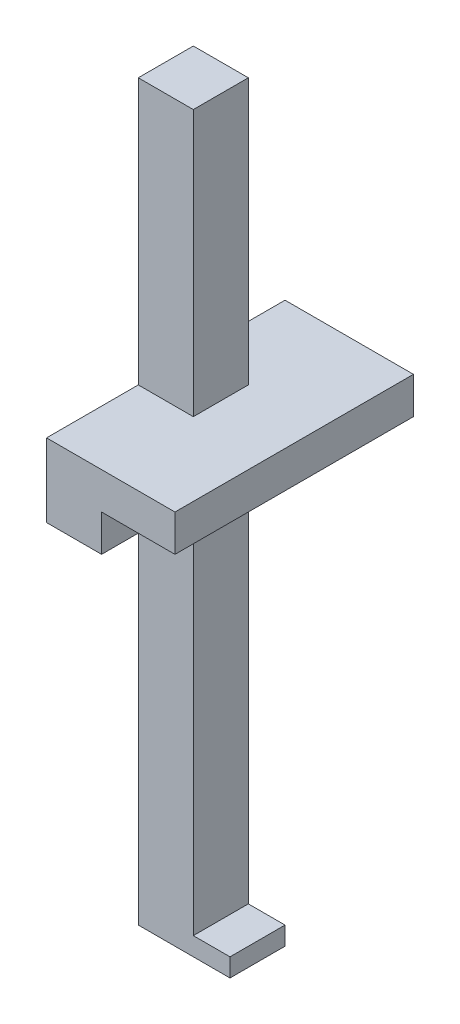
ISO-10303-21;
HEADER;
FILE_DESCRIPTION(('STEP AP214'),'2;1');
FILE_NAME('part.step','',(''),(''),'','','');
FILE_SCHEMA(('AUTOMOTIVE_DESIGN { 1 0 10303 214 1 1 1 1 }'));
ENDSEC;
DATA;
#1=APPLICATION_CONTEXT('core data for automotive mechanical design processes');
#2=APPLICATION_PROTOCOL_DEFINITION('international standard','automotive_design',2000,#1);
#3=PRODUCT_CONTEXT('',#1,'mechanical');
#4=PRODUCT('Part','Part','',(#3));
#5=PRODUCT_RELATED_PRODUCT_CATEGORY('part','',(#4));
#6=PRODUCT_DEFINITION_FORMATION('','',#4);
#7=PRODUCT_DEFINITION_CONTEXT('part definition',#1,'design');
#8=PRODUCT_DEFINITION('design','',#6,#7);
#9=PRODUCT_DEFINITION_SHAPE('','',#8);
#10=(LENGTH_UNIT() NAMED_UNIT(*) SI_UNIT(.MILLI.,.METRE.));
#11=(NAMED_UNIT(*) PLANE_ANGLE_UNIT() SI_UNIT($,.RADIAN.));
#12=(NAMED_UNIT(*) SI_UNIT($,.STERADIAN.) SOLID_ANGLE_UNIT());
#13=UNCERTAINTY_MEASURE_WITH_UNIT(LENGTH_MEASURE(1.E-05),#10,'distance_accuracy_value','');
#14=(GEOMETRIC_REPRESENTATION_CONTEXT(3) GLOBAL_UNCERTAINTY_ASSIGNED_CONTEXT((#13)) GLOBAL_UNIT_ASSIGNED_CONTEXT((#10,
#11,#12)) REPRESENTATION_CONTEXT('',''));
#15=CARTESIAN_POINT('',(0.,0.,0.));
#16=DIRECTION('',(0.,0.,1.));
#17=DIRECTION('',(1.,0.,0.));
#18=AXIS2_PLACEMENT_3D('',#15,#16,#17);
#19=CARTESIAN_POINT('',(3.,40.,3.));
#20=DIRECTION('',(-1.,0.,0.));
#21=DIRECTION('',(0.,-1.,0.));
#22=AXIS2_PLACEMENT_3D('',#19,#20,#21);
#23=PLANE('',#22);
#24=DIRECTION('',(0.,0.,-1.));
#25=VECTOR('',#24,1.);
#26=CARTESIAN_POINT('',(3.,23.5,8.));
#27=LINE('',#26,#25);
#28=CARTESIAN_POINT('',(3.,23.5,8.));
#29=VERTEX_POINT('',#28);
#30=CARTESIAN_POINT('',(3.,23.5,-5.));
#31=VERTEX_POINT('',#30);
#32=EDGE_CURVE('E61',#29,#31,#27,.T.);
#33=ORIENTED_EDGE('',*,*,#32,.F.);
#34=DIRECTION('',(0.,1.,0.));
#35=VECTOR('',#34,1.);
#36=CARTESIAN_POINT('',(3.,25.5,8.));
#37=LINE('',#36,#35);
#38=CARTESIAN_POINT('',(3.,21.5,8.));
#39=VERTEX_POINT('',#38);
#40=EDGE_CURVE('E183',#39,#29,#37,.T.);
#41=ORIENTED_EDGE('',*,*,#40,.F.);
#42=DIRECTION('',(0.,0.,-1.));
#43=VECTOR('',#42,1.);
#44=CARTESIAN_POINT('',(3.,21.5,8.));
#45=LINE('',#44,#43);
#46=CARTESIAN_POINT('',(3.,21.5,3.));
#47=VERTEX_POINT('',#46);
#48=EDGE_CURVE('E244',#39,#47,#45,.T.);
#49=ORIENTED_EDGE('',*,*,#48,.T.);
#50=DIRECTION('',(0.,1.,0.));
#51=VECTOR('',#50,1.);
#52=CARTESIAN_POINT('',(3.,40.,3.));
#53=LINE('',#52,#51);
#54=CARTESIAN_POINT('',(3.,1.,3.));
#55=VERTEX_POINT('',#54);
#56=EDGE_CURVE('E265',#55,#47,#53,.T.);
#57=ORIENTED_EDGE('',*,*,#56,.F.);
#58=DIRECTION('',(0.,0.,-1.));
#59=VECTOR('',#58,1.);
#60=CARTESIAN_POINT('',(3.,1.,3.));
#61=LINE('',#60,#59);
#62=CARTESIAN_POINT('',(3.,1.,0.));
#63=VERTEX_POINT('',#62);
#64=EDGE_CURVE('E308',#55,#63,#61,.T.);
#65=ORIENTED_EDGE('',*,*,#64,.T.);
#66=DIRECTION('',(0.,1.,0.));
#67=VECTOR('',#66,1.);
#68=CARTESIAN_POINT('',(3.,40.,0.));
#69=LINE('',#68,#67);
#70=CARTESIAN_POINT('',(3.,21.5,0.));
#71=VERTEX_POINT('',#70);
#72=EDGE_CURVE('E286',#63,#71,#69,.T.);
#73=ORIENTED_EDGE('',*,*,#72,.T.);
#74=DIRECTION('',(0.,0.,1.));
#75=VECTOR('',#74,1.);
#76=CARTESIAN_POINT('',(3.,21.5,-5.));
#77=LINE('',#76,#75);
#78=CARTESIAN_POINT('',(3.,21.5,-5.));
#79=VERTEX_POINT('',#78);
#80=EDGE_CURVE('E215',#79,#71,#77,.T.);
#81=ORIENTED_EDGE('',*,*,#80,.F.);
#82=DIRECTION('',(0.,1.,0.));
#83=VECTOR('',#82,1.);
#84=CARTESIAN_POINT('',(3.,25.5,-5.));
#85=LINE('',#84,#83);
#86=EDGE_CURVE('E66',#79,#31,#85,.T.);
#87=ORIENTED_EDGE('',*,*,#86,.T.);
#88=EDGE_LOOP('',(#33,#41,#49,#57,#65,#73,#81,#87));
#89=FACE_BOUND('',#88,.T.);
#90=ADVANCED_FACE('F45',(#89),#23,.F.);
#91=DIRECTION('',(0.,0.,1.));
#92=VECTOR('',#91,1.);
#93=CARTESIAN_POINT('',(3.,25.5,8.));
#94=LINE('',#93,#92);
#95=CARTESIAN_POINT('',(3.,25.5,0.));
#96=VERTEX_POINT('',#95);
#97=CARTESIAN_POINT('',(3.,25.5,3.));
#98=VERTEX_POINT('',#97);
#99=EDGE_CURVE('E179',#96,#98,#94,.T.);
#100=ORIENTED_EDGE('',*,*,#99,.F.);
#101=CARTESIAN_POINT('',(3.,40.,0.));
#102=VERTEX_POINT('',#101);
#103=EDGE_CURVE('E285',#96,#102,#69,.T.);
#104=ORIENTED_EDGE('',*,*,#103,.T.);
#105=DIRECTION('',(0.,0.,-1.));
#106=VECTOR('',#105,1.);
#107=CARTESIAN_POINT('',(3.,40.,3.));
#108=LINE('',#107,#106);
#109=CARTESIAN_POINT('',(3.,40.,3.));
#110=VERTEX_POINT('',#109);
#111=EDGE_CURVE('E304',#110,#102,#108,.T.);
#112=ORIENTED_EDGE('',*,*,#111,.F.);
#113=EDGE_CURVE('E264',#98,#110,#53,.T.);
#114=ORIENTED_EDGE('',*,*,#113,.F.);
#115=EDGE_LOOP('',(#100,#104,#112,#114));
#116=FACE_BOUND('',#115,.T.);
#117=ADVANCED_FACE('F346',(#116),#23,.F.);
#118=CARTESIAN_POINT('',(0.,0.,0.));
#119=DIRECTION('',(0.,0.,-1.));
#120=DIRECTION('',(-1.,0.,0.));
#121=AXIS2_PLACEMENT_3D('',#118,#119,#120);
#122=PLANE('',#121);
#123=DIRECTION('',(0.,-1.,0.));
#124=VECTOR('',#123,1.);
#125=CARTESIAN_POINT('',(0.,0.,0.));
#126=LINE('',#125,#124);
#127=CARTESIAN_POINT('',(0.,21.5,0.));
#128=VERTEX_POINT('',#127);
#129=CARTESIAN_POINT('',(0.,0.,0.));
#130=VERTEX_POINT('',#129);
#131=EDGE_CURVE('E293',#128,#130,#126,.T.);
#132=ORIENTED_EDGE('',*,*,#131,.F.);
#133=DIRECTION('',(1.,0.,0.));
#134=VECTOR('',#133,1.);
#135=CARTESIAN_POINT('',(0.,21.5,0.));
#136=LINE('',#135,#134);
#137=EDGE_CURVE('E190',#128,#71,#136,.T.);
#138=ORIENTED_EDGE('',*,*,#137,.T.);
#139=ORIENTED_EDGE('',*,*,#72,.F.);
#140=DIRECTION('',(-1.,0.,0.));
#141=VECTOR('',#140,1.);
#142=CARTESIAN_POINT('',(3.,1.,0.));
#143=LINE('',#142,#141);
#144=CARTESIAN_POINT('',(5.,1.,0.));
#145=VERTEX_POINT('',#144);
#146=EDGE_CURVE('E282',#145,#63,#143,.T.);
#147=ORIENTED_EDGE('',*,*,#146,.F.);
#148=DIRECTION('',(0.,1.,0.));
#149=VECTOR('',#148,1.);
#150=CARTESIAN_POINT('',(5.,1.,0.));
#151=LINE('',#150,#149);
#152=CARTESIAN_POINT('',(5.,0.,0.));
#153=VERTEX_POINT('',#152);
#154=EDGE_CURVE('E279',#153,#145,#151,.T.);
#155=ORIENTED_EDGE('',*,*,#154,.F.);
#156=DIRECTION('',(1.,0.,0.));
#157=VECTOR('',#156,1.);
#158=CARTESIAN_POINT('',(5.,0.,0.));
#159=LINE('',#158,#157);
#160=EDGE_CURVE('E252',#130,#153,#159,.T.);
#161=ORIENTED_EDGE('',*,*,#160,.F.);
#162=EDGE_LOOP('',(#132,#138,#139,#147,#155,#161));
#163=FACE_BOUND('',#162,.T.);
#164=ADVANCED_FACE('F323',(#163),#122,.T.);
#165=ORIENTED_EDGE('',*,*,#103,.F.);
#166=DIRECTION('',(-1.,0.,0.));
#167=VECTOR('',#166,1.);
#168=CARTESIAN_POINT('',(0.,25.5,0.));
#169=LINE('',#168,#167);
#170=CARTESIAN_POINT('',(0.,25.5,0.));
#171=VERTEX_POINT('',#170);
#172=EDGE_CURVE('E185',#96,#171,#169,.T.);
#173=ORIENTED_EDGE('',*,*,#172,.T.);
#174=CARTESIAN_POINT('',(0.,40.,0.));
#175=VERTEX_POINT('',#174);
#176=EDGE_CURVE('E258',#175,#171,#126,.T.);
#177=ORIENTED_EDGE('',*,*,#176,.F.);
#178=DIRECTION('',(-1.,0.,0.));
#179=VECTOR('',#178,1.);
#180=CARTESIAN_POINT('',(0.,40.,0.));
#181=LINE('',#180,#179);
#182=EDGE_CURVE('E290',#102,#175,#181,.T.);
#183=ORIENTED_EDGE('',*,*,#182,.F.);
#184=EDGE_LOOP('',(#165,#173,#177,#183));
#185=FACE_BOUND('',#184,.T.);
#186=ADVANCED_FACE('F357',(#185),#122,.T.);
#187=CARTESIAN_POINT('',(0.,0.,3.));
#188=DIRECTION('',(0.,0.,-1.));
#189=DIRECTION('',(-1.,0.,0.));
#190=AXIS2_PLACEMENT_3D('',#187,#188,#189);
#191=PLANE('',#190);
#192=DIRECTION('',(-1.,0.,0.));
#193=VECTOR('',#192,1.);
#194=CARTESIAN_POINT('',(0.,25.5,3.));
#195=LINE('',#194,#193);
#196=CARTESIAN_POINT('',(0.,25.5,3.));
#197=VERTEX_POINT('',#196);
#198=EDGE_CURVE('E226',#98,#197,#195,.T.);
#199=ORIENTED_EDGE('',*,*,#198,.F.);
#200=ORIENTED_EDGE('',*,*,#113,.T.);
#201=DIRECTION('',(-1.,0.,0.));
#202=VECTOR('',#201,1.);
#203=CARTESIAN_POINT('',(0.,40.,3.));
#204=LINE('',#203,#202);
#205=CARTESIAN_POINT('',(0.,40.,3.));
#206=VERTEX_POINT('',#205);
#207=EDGE_CURVE('E268',#110,#206,#204,.T.);
#208=ORIENTED_EDGE('',*,*,#207,.T.);
#209=DIRECTION('',(0.,-1.,0.));
#210=VECTOR('',#209,1.);
#211=CARTESIAN_POINT('',(0.,0.,3.));
#212=LINE('',#211,#210);
#213=EDGE_CURVE('E272',#206,#197,#212,.T.);
#214=ORIENTED_EDGE('',*,*,#213,.T.);
#215=EDGE_LOOP('',(#199,#200,#208,#214));
#216=FACE_BOUND('',#215,.T.);
#217=ADVANCED_FACE('F362',(#216),#191,.F.);
#218=DIRECTION('',(1.,0.,0.));
#219=VECTOR('',#218,1.);
#220=CARTESIAN_POINT('',(0.,21.5,3.));
#221=LINE('',#220,#219);
#222=CARTESIAN_POINT('',(0.,21.5,3.));
#223=VERTEX_POINT('',#222);
#224=EDGE_CURVE('E221',#223,#47,#221,.T.);
#225=ORIENTED_EDGE('',*,*,#224,.F.);
#226=CARTESIAN_POINT('',(0.,0.,3.));
#227=VERTEX_POINT('',#226);
#228=EDGE_CURVE('E271',#223,#227,#212,.T.);
#229=ORIENTED_EDGE('',*,*,#228,.T.);
#230=DIRECTION('',(1.,0.,0.));
#231=VECTOR('',#230,1.);
#232=CARTESIAN_POINT('',(5.,0.,3.));
#233=LINE('',#232,#231);
#234=CARTESIAN_POINT('',(5.,0.,3.));
#235=VERTEX_POINT('',#234);
#236=EDGE_CURVE('E253',#227,#235,#233,.T.);
#237=ORIENTED_EDGE('',*,*,#236,.T.);
#238=DIRECTION('',(0.,1.,0.));
#239=VECTOR('',#238,1.);
#240=CARTESIAN_POINT('',(5.,1.,3.));
#241=LINE('',#240,#239);
#242=CARTESIAN_POINT('',(5.,1.,3.));
#243=VERTEX_POINT('',#242);
#244=EDGE_CURVE('E257',#235,#243,#241,.T.);
#245=ORIENTED_EDGE('',*,*,#244,.T.);
#246=DIRECTION('',(-1.,0.,0.));
#247=VECTOR('',#246,1.);
#248=CARTESIAN_POINT('',(3.,1.,3.));
#249=LINE('',#248,#247);
#250=EDGE_CURVE('E261',#243,#55,#249,.T.);
#251=ORIENTED_EDGE('',*,*,#250,.T.);
#252=ORIENTED_EDGE('',*,*,#56,.T.);
#253=EDGE_LOOP('',(#225,#229,#237,#245,#251,#252));
#254=FACE_BOUND('',#253,.T.);
#255=ADVANCED_FACE('F329',(#254),#191,.F.);
#256=CARTESIAN_POINT('',(5.,0.,3.));
#257=DIRECTION('',(0.,1.,0.));
#258=DIRECTION('',(-1.,0.,0.));
#259=AXIS2_PLACEMENT_3D('',#256,#257,#258);
#260=PLANE('',#259);
#261=ORIENTED_EDGE('',*,*,#160,.T.);
#262=DIRECTION('',(0.,0.,-1.));
#263=VECTOR('',#262,1.);
#264=CARTESIAN_POINT('',(5.,0.,3.));
#265=LINE('',#264,#263);
#266=EDGE_CURVE('E11',#235,#153,#265,.T.);
#267=ORIENTED_EDGE('',*,*,#266,.F.);
#268=ORIENTED_EDGE('',*,*,#236,.F.);
#269=DIRECTION('',(0.,0.,-1.));
#270=VECTOR('',#269,1.);
#271=CARTESIAN_POINT('',(0.,0.,3.));
#272=LINE('',#271,#270);
#273=EDGE_CURVE('E275',#227,#130,#272,.T.);
#274=ORIENTED_EDGE('',*,*,#273,.T.);
#275=EDGE_LOOP('',(#261,#267,#268,#274));
#276=FACE_BOUND('',#275,.T.);
#277=ADVANCED_FACE('F47',(#276),#260,.F.);
#278=CARTESIAN_POINT('',(5.,1.,3.));
#279=DIRECTION('',(-1.,0.,0.));
#280=DIRECTION('',(0.,0.,1.));
#281=AXIS2_PLACEMENT_3D('',#278,#279,#280);
#282=PLANE('',#281);
#283=ORIENTED_EDGE('',*,*,#154,.T.);
#284=DIRECTION('',(0.,0.,-1.));
#285=VECTOR('',#284,1.);
#286=CARTESIAN_POINT('',(5.,1.,3.));
#287=LINE('',#286,#285);
#288=EDGE_CURVE('E54',#243,#145,#287,.T.);
#289=ORIENTED_EDGE('',*,*,#288,.F.);
#290=ORIENTED_EDGE('',*,*,#244,.F.);
#291=ORIENTED_EDGE('',*,*,#266,.T.);
#292=EDGE_LOOP('',(#283,#289,#290,#291));
#293=FACE_BOUND('',#292,.T.);
#294=ADVANCED_FACE('F379',(#293),#282,.F.);
#295=CARTESIAN_POINT('',(3.,1.,3.));
#296=DIRECTION('',(0.,-1.,0.));
#297=DIRECTION('',(0.,0.,-1.));
#298=AXIS2_PLACEMENT_3D('',#295,#296,#297);
#299=PLANE('',#298);
#300=ORIENTED_EDGE('',*,*,#146,.T.);
#301=ORIENTED_EDGE('',*,*,#64,.F.);
#302=ORIENTED_EDGE('',*,*,#250,.F.);
#303=ORIENTED_EDGE('',*,*,#288,.T.);
#304=EDGE_LOOP('',(#300,#301,#302,#303));
#305=FACE_BOUND('',#304,.T.);
#306=ADVANCED_FACE('F317',(#305),#299,.F.);
#307=CARTESIAN_POINT('',(0.,40.,3.));
#308=DIRECTION('',(0.,-1.,0.));
#309=DIRECTION('',(0.,0.,-1.));
#310=AXIS2_PLACEMENT_3D('',#307,#308,#309);
#311=PLANE('',#310);
#312=ORIENTED_EDGE('',*,*,#182,.T.);
#313=DIRECTION('',(0.,0.,-1.));
#314=VECTOR('',#313,1.);
#315=CARTESIAN_POINT('',(0.,40.,3.));
#316=LINE('',#315,#314);
#317=EDGE_CURVE('E300',#206,#175,#316,.T.);
#318=ORIENTED_EDGE('',*,*,#317,.F.);
#319=ORIENTED_EDGE('',*,*,#207,.F.);
#320=ORIENTED_EDGE('',*,*,#111,.T.);
#321=EDGE_LOOP('',(#312,#318,#319,#320));
#322=FACE_BOUND('',#321,.T.);
#323=ADVANCED_FACE('F354',(#322),#311,.F.);
#324=CARTESIAN_POINT('',(0.,0.,3.));
#325=DIRECTION('',(1.,0.,0.));
#326=DIRECTION('',(0.,0.,-1.));
#327=AXIS2_PLACEMENT_3D('',#324,#325,#326);
#328=PLANE('',#327);
#329=ORIENTED_EDGE('',*,*,#176,.T.);
#330=DIRECTION('',(0.,0.,1.));
#331=VECTOR('',#330,1.);
#332=CARTESIAN_POINT('',(0.,25.5,-5.));
#333=LINE('',#332,#331);
#334=CARTESIAN_POINT('',(0.,25.5,-5.));
#335=VERTEX_POINT('',#334);
#336=EDGE_CURVE('E218',#335,#171,#333,.T.);
#337=ORIENTED_EDGE('',*,*,#336,.F.);
#338=DIRECTION('',(0.,-1.,0.));
#339=VECTOR('',#338,1.);
#340=CARTESIAN_POINT('',(0.,25.5,-5.));
#341=LINE('',#340,#339);
#342=CARTESIAN_POINT('',(0.,21.5,-5.));
#343=VERTEX_POINT('',#342);
#344=EDGE_CURVE('E195',#335,#343,#341,.T.);
#345=ORIENTED_EDGE('',*,*,#344,.T.);
#346=DIRECTION('',(0.,0.,1.));
#347=VECTOR('',#346,1.);
#348=CARTESIAN_POINT('',(0.,21.5,-5.));
#349=LINE('',#348,#347);
#350=EDGE_CURVE('E208',#343,#128,#349,.T.);
#351=ORIENTED_EDGE('',*,*,#350,.T.);
#352=ORIENTED_EDGE('',*,*,#131,.T.);
#353=ORIENTED_EDGE('',*,*,#273,.F.);
#354=ORIENTED_EDGE('',*,*,#228,.F.);
#355=DIRECTION('',(0.,0.,-1.));
#356=VECTOR('',#355,1.);
#357=CARTESIAN_POINT('',(0.,21.5,8.));
#358=LINE('',#357,#356);
#359=CARTESIAN_POINT('',(0.,21.5,8.));
#360=VERTEX_POINT('',#359);
#361=EDGE_CURVE('E248',#360,#223,#358,.T.);
#362=ORIENTED_EDGE('',*,*,#361,.F.);
#363=DIRECTION('',(0.,-1.,0.));
#364=VECTOR('',#363,1.);
#365=CARTESIAN_POINT('',(0.,25.5,8.));
#366=LINE('',#365,#364);
#367=CARTESIAN_POINT('',(0.,25.5,8.));
#368=VERTEX_POINT('',#367);
#369=EDGE_CURVE('E222',#368,#360,#366,.T.);
#370=ORIENTED_EDGE('',*,*,#369,.F.);
#371=DIRECTION('',(0.,0.,-1.));
#372=VECTOR('',#371,1.);
#373=CARTESIAN_POINT('',(0.,25.5,8.));
#374=LINE('',#373,#372);
#375=EDGE_CURVE('E234',#368,#197,#374,.T.);
#376=ORIENTED_EDGE('',*,*,#375,.T.);
#377=ORIENTED_EDGE('',*,*,#213,.F.);
#378=ORIENTED_EDGE('',*,*,#317,.T.);
#379=EDGE_LOOP('',(#329,#337,#345,#351,#352,#353,#354,#362,#370,#376,#377,#378));
#380=FACE_BOUND('',#379,.T.);
#381=ADVANCED_FACE('F336',(#380),#328,.F.);
#382=CARTESIAN_POINT('',(0.,21.5,8.));
#383=DIRECTION('',(0.,1.,0.));
#384=DIRECTION('',(0.,0.,1.));
#385=AXIS2_PLACEMENT_3D('',#382,#383,#384);
#386=PLANE('',#385);
#387=ORIENTED_EDGE('',*,*,#224,.T.);
#388=ORIENTED_EDGE('',*,*,#48,.F.);
#389=DIRECTION('',(1.,0.,0.));
#390=VECTOR('',#389,1.);
#391=CARTESIAN_POINT('',(0.,21.5,8.));
#392=LINE('',#391,#390);
#393=EDGE_CURVE('E225',#360,#39,#392,.T.);
#394=ORIENTED_EDGE('',*,*,#393,.F.);
#395=ORIENTED_EDGE('',*,*,#361,.T.);
#396=EDGE_LOOP('',(#387,#388,#394,#395));
#397=FACE_BOUND('',#396,.T.);
#398=ADVANCED_FACE('F332',(#397),#386,.F.);
#399=CARTESIAN_POINT('',(0.,25.5,8.));
#400=DIRECTION('',(0.,-1.,0.));
#401=DIRECTION('',(0.,0.,-1.));
#402=AXIS2_PLACEMENT_3D('',#399,#400,#401);
#403=PLANE('',#402);
#404=ORIENTED_EDGE('',*,*,#198,.T.);
#405=ORIENTED_EDGE('',*,*,#375,.F.);
#406=DIRECTION('',(-1.,0.,0.));
#407=VECTOR('',#406,1.);
#408=CARTESIAN_POINT('',(0.,25.5,8.));
#409=LINE('',#408,#407);
#410=CARTESIAN_POINT('',(7.,25.5,8.));
#411=VERTEX_POINT('',#410);
#412=EDGE_CURVE('E231',#411,#368,#409,.T.);
#413=ORIENTED_EDGE('',*,*,#412,.F.);
#414=DIRECTION('',(0.,0.,1.));
#415=VECTOR('',#414,1.);
#416=CARTESIAN_POINT('',(7.,25.5,8.));
#417=LINE('',#416,#415);
#418=CARTESIAN_POINT('',(7.,25.5,-5.));
#419=VERTEX_POINT('',#418);
#420=EDGE_CURVE('E176',#419,#411,#417,.T.);
#421=ORIENTED_EDGE('',*,*,#420,.F.);
#422=DIRECTION('',(-1.,0.,0.));
#423=VECTOR('',#422,1.);
#424=CARTESIAN_POINT('',(0.,25.5,-5.));
#425=LINE('',#424,#423);
#426=EDGE_CURVE('E199',#419,#335,#425,.T.);
#427=ORIENTED_EDGE('',*,*,#426,.T.);
#428=ORIENTED_EDGE('',*,*,#336,.T.);
#429=ORIENTED_EDGE('',*,*,#172,.F.);
#430=ORIENTED_EDGE('',*,*,#99,.T.);
#431=EDGE_LOOP('',(#404,#405,#413,#421,#427,#428,#429,#430));
#432=FACE_BOUND('',#431,.T.);
#433=ADVANCED_FACE('F364',(#432),#403,.F.);
#434=CARTESIAN_POINT('',(0.,0.,8.));
#435=DIRECTION('',(0.,0.,1.));
#436=DIRECTION('',(1.,0.,0.));
#437=AXIS2_PLACEMENT_3D('',#434,#435,#436);
#438=PLANE('',#437);
#439=ORIENTED_EDGE('',*,*,#369,.T.);
#440=ORIENTED_EDGE('',*,*,#393,.T.);
#441=ORIENTED_EDGE('',*,*,#40,.T.);
#442=DIRECTION('',(-1.,0.,0.));
#443=VECTOR('',#442,1.);
#444=CARTESIAN_POINT('',(7.,23.5,8.));
#445=LINE('',#444,#443);
#446=CARTESIAN_POINT('',(7.,23.5,8.));
#447=VERTEX_POINT('',#446);
#448=EDGE_CURVE('E162',#447,#29,#445,.T.);
#449=ORIENTED_EDGE('',*,*,#448,.F.);
#450=DIRECTION('',(0.,-1.,0.));
#451=VECTOR('',#450,1.);
#452=CARTESIAN_POINT('',(7.,25.5,8.));
#453=LINE('',#452,#451);
#454=EDGE_CURVE('E170',#411,#447,#453,.T.);
#455=ORIENTED_EDGE('',*,*,#454,.F.);
#456=ORIENTED_EDGE('',*,*,#412,.T.);
#457=EDGE_LOOP('',(#439,#440,#441,#449,#455,#456));
#458=FACE_BOUND('',#457,.T.);
#459=ADVANCED_FACE('F182',(#458),#438,.T.);
#460=CARTESIAN_POINT('',(0.,21.5,-5.));
#461=DIRECTION('',(0.,-1.,0.));
#462=DIRECTION('',(0.,0.,-1.));
#463=AXIS2_PLACEMENT_3D('',#460,#461,#462);
#464=PLANE('',#463);
#465=ORIENTED_EDGE('',*,*,#137,.F.);
#466=ORIENTED_EDGE('',*,*,#350,.F.);
#467=DIRECTION('',(1.,0.,0.));
#468=VECTOR('',#467,1.);
#469=CARTESIAN_POINT('',(0.,21.5,-5.));
#470=LINE('',#469,#468);
#471=EDGE_CURVE('E205',#343,#79,#470,.T.);
#472=ORIENTED_EDGE('',*,*,#471,.T.);
#473=ORIENTED_EDGE('',*,*,#80,.T.);
#474=EDGE_LOOP('',(#465,#466,#472,#473));
#475=FACE_BOUND('',#474,.T.);
#476=ADVANCED_FACE('F376',(#475),#464,.T.);
#477=CARTESIAN_POINT('',(0.,0.,-5.));
#478=DIRECTION('',(0.,0.,-1.));
#479=DIRECTION('',(1.,0.,0.));
#480=AXIS2_PLACEMENT_3D('',#477,#478,#479);
#481=PLANE('',#480);
#482=ORIENTED_EDGE('',*,*,#344,.F.);
#483=ORIENTED_EDGE('',*,*,#426,.F.);
#484=DIRECTION('',(0.,1.,0.));
#485=VECTOR('',#484,1.);
#486=CARTESIAN_POINT('',(7.,25.5,-5.));
#487=LINE('',#486,#485);
#488=CARTESIAN_POINT('',(7.,23.5,-5.));
#489=VERTEX_POINT('',#488);
#490=EDGE_CURVE('E169',#489,#419,#487,.T.);
#491=ORIENTED_EDGE('',*,*,#490,.F.);
#492=DIRECTION('',(-1.,0.,0.));
#493=VECTOR('',#492,1.);
#494=CARTESIAN_POINT('',(7.,23.5,-5.));
#495=LINE('',#494,#493);
#496=EDGE_CURVE('E164',#489,#31,#495,.T.);
#497=ORIENTED_EDGE('',*,*,#496,.T.);
#498=ORIENTED_EDGE('',*,*,#86,.F.);
#499=ORIENTED_EDGE('',*,*,#471,.F.);
#500=EDGE_LOOP('',(#482,#483,#491,#497,#498,#499));
#501=FACE_BOUND('',#500,.T.);
#502=ADVANCED_FACE('F373',(#501),#481,.T.);
#503=CARTESIAN_POINT('',(7.,23.5,8.));
#504=DIRECTION('',(0.,1.,0.));
#505=DIRECTION('',(-1.,0.,0.));
#506=AXIS2_PLACEMENT_3D('',#503,#504,#505);
#507=PLANE('',#506);
#508=ORIENTED_EDGE('',*,*,#32,.T.);
#509=ORIENTED_EDGE('',*,*,#496,.F.);
#510=DIRECTION('',(0.,0.,-1.));
#511=VECTOR('',#510,1.);
#512=CARTESIAN_POINT('',(7.,23.5,8.));
#513=LINE('',#512,#511);
#514=EDGE_CURVE('E158',#447,#489,#513,.T.);
#515=ORIENTED_EDGE('',*,*,#514,.F.);
#516=ORIENTED_EDGE('',*,*,#448,.T.);
#517=EDGE_LOOP('',(#508,#509,#515,#516));
#518=FACE_BOUND('',#517,.T.);
#519=ADVANCED_FACE('F160',(#518),#507,.F.);
#520=CARTESIAN_POINT('',(7.,0.,0.));
#521=DIRECTION('',(1.,0.,0.));
#522=DIRECTION('',(0.,0.,-1.));
#523=AXIS2_PLACEMENT_3D('',#520,#521,#522);
#524=PLANE('',#523);
#525=ORIENTED_EDGE('',*,*,#454,.T.);
#526=ORIENTED_EDGE('',*,*,#514,.T.);
#527=ORIENTED_EDGE('',*,*,#490,.T.);
#528=ORIENTED_EDGE('',*,*,#420,.T.);
#529=EDGE_LOOP('',(#525,#526,#527,#528));
#530=FACE_BOUND('',#529,.T.);
#531=ADVANCED_FACE('F174',(#530),#524,.T.);
#532=CLOSED_SHELL('',(#90,#117,#164,#186,#217,#255,#277,#294,#306,#323,#381,#398,#433,#459,#476,
#502,#519,#531));
#533=MANIFOLD_SOLID_BREP('B2',#532);
#534=ADVANCED_BREP_SHAPE_REPRESENTATION('',(#18,#533),#14);
#535=SHAPE_DEFINITION_REPRESENTATION(#9,#534);
ENDSEC;
END-ISO-10303-21;
